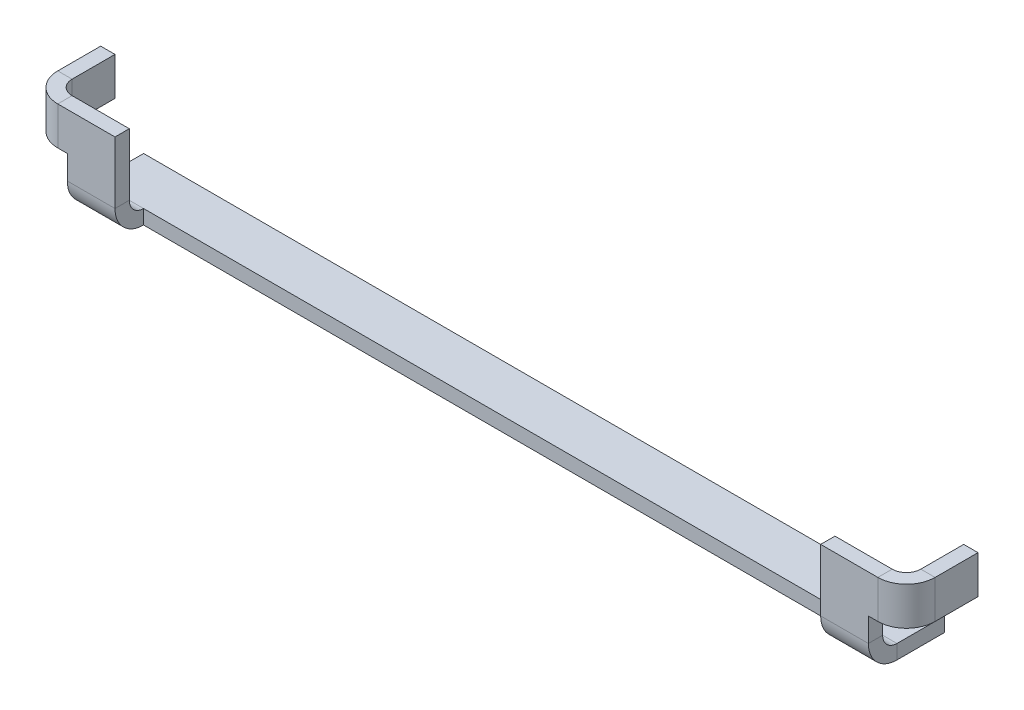
ISO-10303-21;
HEADER;
FILE_DESCRIPTION(('STEP AP214'),'2;1');
FILE_NAME('part.step','',(''),(''),'','','');
FILE_SCHEMA(('AUTOMOTIVE_DESIGN { 1 0 10303 214 1 1 1 1 }'));
ENDSEC;
DATA;
#1=APPLICATION_CONTEXT('core data for automotive mechanical design processes');
#2=APPLICATION_PROTOCOL_DEFINITION('international standard','automotive_design',2000,#1);
#3=PRODUCT_CONTEXT('',#1,'mechanical');
#4=PRODUCT('Part','Part','',(#3));
#5=PRODUCT_RELATED_PRODUCT_CATEGORY('part','',(#4));
#6=PRODUCT_DEFINITION_FORMATION('','',#4);
#7=PRODUCT_DEFINITION_CONTEXT('part definition',#1,'design');
#8=PRODUCT_DEFINITION('design','',#6,#7);
#9=PRODUCT_DEFINITION_SHAPE('','',#8);
#10=(LENGTH_UNIT() NAMED_UNIT(*) SI_UNIT(.MILLI.,.METRE.));
#11=(NAMED_UNIT(*) PLANE_ANGLE_UNIT() SI_UNIT($,.RADIAN.));
#12=(NAMED_UNIT(*) SI_UNIT($,.STERADIAN.) SOLID_ANGLE_UNIT());
#13=UNCERTAINTY_MEASURE_WITH_UNIT(LENGTH_MEASURE(1.E-05),#10,'distance_accuracy_value','');
#14=(GEOMETRIC_REPRESENTATION_CONTEXT(3) GLOBAL_UNCERTAINTY_ASSIGNED_CONTEXT((#13)) GLOBAL_UNIT_ASSIGNED_CONTEXT((#10,
#11,#12)) REPRESENTATION_CONTEXT('',''));
#15=CARTESIAN_POINT('',(0.,0.,0.));
#16=DIRECTION('',(0.,0.,1.));
#17=DIRECTION('',(1.,0.,0.));
#18=AXIS2_PLACEMENT_3D('',#15,#16,#17);
#19=CARTESIAN_POINT('',(0.,1.5,0.));
#20=DIRECTION('',(0.,-1.,0.));
#21=DIRECTION('',(0.,0.,-1.));
#22=AXIS2_PLACEMENT_3D('',#19,#20,#21);
#23=PLANE('',#22);
#24=DIRECTION('',(0.,0.,-1.));
#25=VECTOR('',#24,1.);
#26=CARTESIAN_POINT('',(-42.,1.5,0.));
#27=LINE('',#26,#25);
#28=CARTESIAN_POINT('',(-42.,1.5,37.5));
#29=VERTEX_POINT('',#28);
#30=CARTESIAN_POINT('',(-42.,1.5,42.5));
#31=VERTEX_POINT('',#30);
#32=EDGE_CURVE('E502',#29,#31,#27,.F.);
#33=ORIENTED_EDGE('',*,*,#32,.T.);
#34=DIRECTION('',(-1.,0.,0.));
#35=VECTOR('',#34,1.);
#36=CARTESIAN_POINT('',(-37.,1.5,42.5));
#37=LINE('',#36,#35);
#38=CARTESIAN_POINT('',(-37.,1.5,42.5));
#39=VERTEX_POINT('',#38);
#40=EDGE_CURVE('E358',#31,#39,#37,.F.);
#41=ORIENTED_EDGE('',*,*,#40,.T.);
#42=DIRECTION('',(1.,0.,0.));
#43=VECTOR('',#42,1.);
#44=CARTESIAN_POINT('',(-37.,1.5,42.5));
#45=LINE('',#44,#43);
#46=CARTESIAN_POINT('',(37.,1.5,42.5));
#47=VERTEX_POINT('',#46);
#48=EDGE_CURVE('E489',#39,#47,#45,.T.);
#49=ORIENTED_EDGE('',*,*,#48,.T.);
#50=DIRECTION('',(-1.,0.,0.));
#51=VECTOR('',#50,1.);
#52=CARTESIAN_POINT('',(42.,1.5,42.5));
#53=LINE('',#52,#51);
#54=CARTESIAN_POINT('',(42.,1.5,42.5));
#55=VERTEX_POINT('',#54);
#56=EDGE_CURVE('E453',#47,#55,#53,.F.);
#57=ORIENTED_EDGE('',*,*,#56,.T.);
#58=DIRECTION('',(0.,0.,-1.));
#59=VECTOR('',#58,1.);
#60=CARTESIAN_POINT('',(42.,1.5,0.));
#61=LINE('',#60,#59);
#62=CARTESIAN_POINT('',(42.,1.5,37.5));
#63=VERTEX_POINT('',#62);
#64=EDGE_CURVE('E503',#55,#63,#61,.T.);
#65=ORIENTED_EDGE('',*,*,#64,.T.);
#66=DIRECTION('',(1.,0.,0.));
#67=VECTOR('',#66,1.);
#68=CARTESIAN_POINT('',(0.,1.5,37.5));
#69=LINE('',#68,#67);
#70=EDGE_CURVE('E500',#63,#29,#69,.F.);
#71=ORIENTED_EDGE('',*,*,#70,.T.);
#72=EDGE_LOOP('',(#33,#41,#49,#57,#65,#71));
#73=FACE_BOUND('',#72,.T.);
#74=ADVANCED_FACE('F47',(#73),#23,.F.);
#75=CARTESIAN_POINT('',(0.,0.,0.));
#76=DIRECTION('',(0.,-1.,0.));
#77=DIRECTION('',(0.,0.,-1.));
#78=AXIS2_PLACEMENT_3D('',#75,#76,#77);
#79=PLANE('',#78);
#80=DIRECTION('',(1.,0.,0.));
#81=VECTOR('',#80,1.);
#82=CARTESIAN_POINT('',(0.,0.,42.5));
#83=LINE('',#82,#81);
#84=CARTESIAN_POINT('',(-42.,0.,42.5));
#85=VERTEX_POINT('',#84);
#86=CARTESIAN_POINT('',(-37.,0.,42.5));
#87=VERTEX_POINT('',#86);
#88=EDGE_CURVE('E363',#85,#87,#83,.T.);
#89=ORIENTED_EDGE('',*,*,#88,.F.);
#90=DIRECTION('',(0.,0.,1.));
#91=VECTOR('',#90,1.);
#92=CARTESIAN_POINT('',(-42.,0.,0.));
#93=LINE('',#92,#91);
#94=CARTESIAN_POINT('',(-42.,0.,37.5));
#95=VERTEX_POINT('',#94);
#96=EDGE_CURVE('E497',#95,#85,#93,.T.);
#97=ORIENTED_EDGE('',*,*,#96,.F.);
#98=DIRECTION('',(-1.,0.,0.));
#99=VECTOR('',#98,1.);
#100=CARTESIAN_POINT('',(0.,0.,37.5));
#101=LINE('',#100,#99);
#102=CARTESIAN_POINT('',(42.,0.,37.5));
#103=VERTEX_POINT('',#102);
#104=EDGE_CURVE('E494',#103,#95,#101,.T.);
#105=ORIENTED_EDGE('',*,*,#104,.F.);
#106=DIRECTION('',(0.,0.,-1.));
#107=VECTOR('',#106,1.);
#108=CARTESIAN_POINT('',(42.,0.,0.));
#109=LINE('',#108,#107);
#110=CARTESIAN_POINT('',(42.,0.,42.5));
#111=VERTEX_POINT('',#110);
#112=EDGE_CURVE('E498',#111,#103,#109,.T.);
#113=ORIENTED_EDGE('',*,*,#112,.F.);
#114=DIRECTION('',(1.,0.,0.));
#115=VECTOR('',#114,1.);
#116=CARTESIAN_POINT('',(0.,0.,42.5));
#117=LINE('',#116,#115);
#118=CARTESIAN_POINT('',(37.,0.,42.5));
#119=VERTEX_POINT('',#118);
#120=EDGE_CURVE('E372',#119,#111,#117,.T.);
#121=ORIENTED_EDGE('',*,*,#120,.F.);
#122=DIRECTION('',(1.,0.,0.));
#123=VECTOR('',#122,1.);
#124=CARTESIAN_POINT('',(0.,0.,42.5));
#125=LINE('',#124,#123);
#126=EDGE_CURVE('E409',#87,#119,#125,.T.);
#127=ORIENTED_EDGE('',*,*,#126,.F.);
#128=EDGE_LOOP('',(#89,#97,#105,#113,#121,#127));
#129=FACE_BOUND('',#128,.T.);
#130=ADVANCED_FACE('F640',(#129),#79,.T.);
#131=CARTESIAN_POINT('',(44.5,5.5,44.));
#132=DIRECTION('',(0.,1.,0.));
#133=DIRECTION('',(-1.,0.,0.));
#134=AXIS2_PLACEMENT_3D('',#131,#132,#133);
#135=PLANE('',#134);
#136=DIRECTION('',(0.,0.,-1.));
#137=VECTOR('',#136,1.);
#138=CARTESIAN_POINT('',(43.,5.5,44.));
#139=LINE('',#138,#137);
#140=CARTESIAN_POINT('',(43.,5.5,45.5));
#141=VERTEX_POINT('',#140);
#142=CARTESIAN_POINT('',(43.,5.5,44.));
#143=VERTEX_POINT('',#142);
#144=EDGE_CURVE('E11',#141,#143,#139,.T.);
#145=ORIENTED_EDGE('',*,*,#144,.F.);
#146=DIRECTION('',(1.,0.,0.));
#147=VECTOR('',#146,1.);
#148=CARTESIAN_POINT('',(37.,5.5,45.5));
#149=LINE('',#148,#147);
#150=CARTESIAN_POINT('',(42.,5.5,45.5));
#151=VERTEX_POINT('',#150);
#152=EDGE_CURVE('E157',#141,#151,#149,.F.);
#153=ORIENTED_EDGE('',*,*,#152,.T.);
#154=DIRECTION('',(0.,0.,-1.));
#155=VECTOR('',#154,1.);
#156=CARTESIAN_POINT('',(42.,5.5,44.));
#157=LINE('',#156,#155);
#158=CARTESIAN_POINT('',(42.,5.5,44.));
#159=VERTEX_POINT('',#158);
#160=EDGE_CURVE('E58',#151,#159,#157,.T.);
#161=ORIENTED_EDGE('',*,*,#160,.T.);
#162=DIRECTION('',(-1.,0.,0.));
#163=VECTOR('',#162,1.);
#164=CARTESIAN_POINT('',(44.5,5.5,44.));
#165=LINE('',#164,#163);
#166=EDGE_CURVE('E160',#143,#159,#165,.T.);
#167=ORIENTED_EDGE('',*,*,#166,.F.);
#168=EDGE_LOOP('',(#145,#153,#161,#167));
#169=FACE_BOUND('',#168,.T.);
#170=ADVANCED_FACE('F154',(#169),#135,.F.);
#171=CARTESIAN_POINT('',(42.,9.5,44.));
#172=DIRECTION('',(-1.,0.,0.));
#173=DIRECTION('',(0.,-1.,0.));
#174=AXIS2_PLACEMENT_3D('',#171,#172,#173);
#175=PLANE('',#174);
#176=ORIENTED_EDGE('',*,*,#160,.F.);
#177=DIRECTION('',(0.,1.,0.));
#178=VECTOR('',#177,1.);
#179=CARTESIAN_POINT('',(42.,9.5,45.5));
#180=LINE('',#179,#178);
#181=CARTESIAN_POINT('',(42.,3.,45.5));
#182=VERTEX_POINT('',#181);
#183=EDGE_CURVE('E188',#151,#182,#180,.F.);
#184=ORIENTED_EDGE('',*,*,#183,.T.);
#185=DIRECTION('',(0.,0.,-1.));
#186=VECTOR('',#185,1.);
#187=CARTESIAN_POINT('',(42.,3.,44.));
#188=LINE('',#187,#186);
#189=CARTESIAN_POINT('',(42.,3.,44.));
#190=VERTEX_POINT('',#189);
#191=EDGE_CURVE('E272',#182,#190,#188,.T.);
#192=ORIENTED_EDGE('',*,*,#191,.T.);
#193=DIRECTION('',(0.,-1.,0.));
#194=VECTOR('',#193,1.);
#195=CARTESIAN_POINT('',(42.,9.5,44.));
#196=LINE('',#195,#194);
#197=EDGE_CURVE('E291',#159,#190,#196,.T.);
#198=ORIENTED_EDGE('',*,*,#197,.F.);
#199=EDGE_LOOP('',(#176,#184,#192,#198));
#200=FACE_BOUND('',#199,.T.);
#201=ADVANCED_FACE('F299',(#200),#175,.F.);
#202=CARTESIAN_POINT('',(42.,3.,42.5));
#203=DIRECTION('',(1.,0.,0.));
#204=DIRECTION('',(0.,0.,-1.));
#205=AXIS2_PLACEMENT_3D('',#202,#203,#204);
#206=PLANE('',#205);
#207=ORIENTED_EDGE('',*,*,#191,.F.);
#208=CARTESIAN_POINT('',(42.,3.,42.5));
#209=DIRECTION('',(1.,0.,0.));
#210=DIRECTION('',(0.,0.,-1.));
#211=AXIS2_PLACEMENT_3D('',#208,#209,#210);
#212=CIRCLE('',#211,3.);
#213=EDGE_CURVE('E203',#182,#111,#212,.T.);
#214=ORIENTED_EDGE('',*,*,#213,.T.);
#215=DIRECTION('',(0.,1.,0.));
#216=VECTOR('',#215,1.);
#217=CARTESIAN_POINT('',(42.,1.5,42.5));
#218=LINE('',#217,#216);
#219=EDGE_CURVE('E268',#111,#55,#218,.T.);
#220=ORIENTED_EDGE('',*,*,#219,.T.);
#221=CARTESIAN_POINT('',(42.,3.,42.5));
#222=DIRECTION('',(-1.,0.,0.));
#223=DIRECTION('',(0.,0.,1.));
#224=AXIS2_PLACEMENT_3D('',#221,#222,#223);
#225=CIRCLE('',#224,1.5);
#226=EDGE_CURVE('E448',#190,#55,#225,.F.);
#227=ORIENTED_EDGE('',*,*,#226,.F.);
#228=EDGE_LOOP('',(#207,#214,#220,#227));
#229=FACE_BOUND('',#228,.T.);
#230=ADVANCED_FACE('F1082',(#229),#206,.T.);
#231=CARTESIAN_POINT('',(-42.,3.,42.5));
#232=DIRECTION('',(1.,0.,0.));
#233=DIRECTION('',(0.,0.,-1.));
#234=AXIS2_PLACEMENT_3D('',#231,#232,#233);
#235=PLANE('',#234);
#236=DIRECTION('',(0.,1.,0.));
#237=VECTOR('',#236,1.);
#238=CARTESIAN_POINT('',(-42.,1.5,42.5));
#239=LINE('',#238,#237);
#240=EDGE_CURVE('E265',#85,#31,#239,.T.);
#241=ORIENTED_EDGE('',*,*,#240,.F.);
#242=CARTESIAN_POINT('',(-42.,3.,42.5));
#243=DIRECTION('',(1.,0.,0.));
#244=DIRECTION('',(0.,0.,-1.));
#245=AXIS2_PLACEMENT_3D('',#242,#243,#244);
#246=CIRCLE('',#245,3.);
#247=CARTESIAN_POINT('',(-42.,3.,45.5));
#248=VERTEX_POINT('',#247);
#249=EDGE_CURVE('E419',#85,#248,#246,.F.);
#250=ORIENTED_EDGE('',*,*,#249,.T.);
#251=DIRECTION('',(0.,0.,-1.));
#252=VECTOR('',#251,1.);
#253=CARTESIAN_POINT('',(-42.,3.,44.));
#254=LINE('',#253,#252);
#255=CARTESIAN_POINT('',(-42.,3.,44.));
#256=VERTEX_POINT('',#255);
#257=EDGE_CURVE('E66',#248,#256,#254,.T.);
#258=ORIENTED_EDGE('',*,*,#257,.T.);
#259=CARTESIAN_POINT('',(-42.,3.,42.5));
#260=DIRECTION('',(-1.,0.,0.));
#261=DIRECTION('',(0.,0.,1.));
#262=AXIS2_PLACEMENT_3D('',#259,#260,#261);
#263=CIRCLE('',#262,1.5);
#264=EDGE_CURVE('E361',#31,#256,#263,.T.);
#265=ORIENTED_EDGE('',*,*,#264,.F.);
#266=EDGE_LOOP('',(#241,#250,#258,#265));
#267=FACE_BOUND('',#266,.T.);
#268=ADVANCED_FACE('F1069',(#267),#235,.F.);
#269=CARTESIAN_POINT('',(-42.,9.5,44.));
#270=DIRECTION('',(-1.,0.,0.));
#271=DIRECTION('',(0.,-1.,0.));
#272=AXIS2_PLACEMENT_3D('',#269,#270,#271);
#273=PLANE('',#272);
#274=ORIENTED_EDGE('',*,*,#257,.F.);
#275=DIRECTION('',(0.,1.,0.));
#276=VECTOR('',#275,1.);
#277=CARTESIAN_POINT('',(-42.,9.5,45.5));
#278=LINE('',#277,#276);
#279=CARTESIAN_POINT('',(-42.,5.5,45.5));
#280=VERTEX_POINT('',#279);
#281=EDGE_CURVE('E196',#280,#248,#278,.F.);
#282=ORIENTED_EDGE('',*,*,#281,.F.);
#283=DIRECTION('',(0.,0.,-1.));
#284=VECTOR('',#283,1.);
#285=CARTESIAN_POINT('',(-42.,5.5,44.));
#286=LINE('',#285,#284);
#287=CARTESIAN_POINT('',(-42.,5.5,44.));
#288=VERTEX_POINT('',#287);
#289=EDGE_CURVE('E261',#280,#288,#286,.T.);
#290=ORIENTED_EDGE('',*,*,#289,.T.);
#291=DIRECTION('',(0.,-1.,0.));
#292=VECTOR('',#291,1.);
#293=CARTESIAN_POINT('',(-42.,9.5,44.));
#294=LINE('',#293,#292);
#295=EDGE_CURVE('E444',#288,#256,#294,.T.);
#296=ORIENTED_EDGE('',*,*,#295,.T.);
#297=EDGE_LOOP('',(#274,#282,#290,#296));
#298=FACE_BOUND('',#297,.T.);
#299=ADVANCED_FACE('F563',(#298),#273,.T.);
#300=CARTESIAN_POINT('',(-44.5,5.5,44.));
#301=DIRECTION('',(0.,1.,0.));
#302=DIRECTION('',(-1.,0.,0.));
#303=AXIS2_PLACEMENT_3D('',#300,#301,#302);
#304=PLANE('',#303);
#305=ORIENTED_EDGE('',*,*,#289,.F.);
#306=DIRECTION('',(1.,0.,0.));
#307=VECTOR('',#306,1.);
#308=CARTESIAN_POINT('',(-42.,5.5,45.5));
#309=LINE('',#308,#307);
#310=CARTESIAN_POINT('',(-43.,5.5,45.5));
#311=VERTEX_POINT('',#310);
#312=EDGE_CURVE('E200',#280,#311,#309,.F.);
#313=ORIENTED_EDGE('',*,*,#312,.T.);
#314=DIRECTION('',(0.,0.,-1.));
#315=VECTOR('',#314,1.);
#316=CARTESIAN_POINT('',(-43.,5.5,44.));
#317=LINE('',#316,#315);
#318=CARTESIAN_POINT('',(-43.,5.5,44.));
#319=VERTEX_POINT('',#318);
#320=EDGE_CURVE('E258',#311,#319,#317,.T.);
#321=ORIENTED_EDGE('',*,*,#320,.T.);
#322=DIRECTION('',(-1.,0.,0.));
#323=VECTOR('',#322,1.);
#324=CARTESIAN_POINT('',(-44.5,5.5,44.));
#325=LINE('',#324,#323);
#326=EDGE_CURVE('E527',#288,#319,#325,.T.);
#327=ORIENTED_EDGE('',*,*,#326,.F.);
#328=EDGE_LOOP('',(#305,#313,#321,#327));
#329=FACE_BOUND('',#328,.T.);
#330=ADVANCED_FACE('F570',(#329),#304,.F.);
#331=CARTESIAN_POINT('',(-43.,5.5,42.5));
#332=DIRECTION('',(0.,-1.,0.));
#333=DIRECTION('',(0.,0.,-1.));
#334=AXIS2_PLACEMENT_3D('',#331,#332,#333);
#335=PLANE('',#334);
#336=ORIENTED_EDGE('',*,*,#320,.F.);
#337=CARTESIAN_POINT('',(-43.,5.5,42.5));
#338=DIRECTION('',(0.,1.,0.));
#339=DIRECTION('',(0.,0.,1.));
#340=AXIS2_PLACEMENT_3D('',#337,#338,#339);
#341=CIRCLE('',#340,3.);
#342=CARTESIAN_POINT('',(-46.,5.5,42.5));
#343=VERTEX_POINT('',#342);
#344=EDGE_CURVE('E408',#311,#343,#341,.F.);
#345=ORIENTED_EDGE('',*,*,#344,.T.);
#346=DIRECTION('',(1.,0.,0.));
#347=VECTOR('',#346,1.);
#348=CARTESIAN_POINT('',(-44.5,5.5,42.5));
#349=LINE('',#348,#347);
#350=CARTESIAN_POINT('',(-44.5,5.5,42.5));
#351=VERTEX_POINT('',#350);
#352=EDGE_CURVE('E255',#343,#351,#349,.T.);
#353=ORIENTED_EDGE('',*,*,#352,.T.);
#354=CARTESIAN_POINT('',(-43.,5.5,42.5));
#355=DIRECTION('',(0.,1.,0.));
#356=DIRECTION('',(0.,0.,1.));
#357=AXIS2_PLACEMENT_3D('',#354,#355,#356);
#358=CIRCLE('',#357,1.5);
#359=EDGE_CURVE('E351',#319,#351,#358,.F.);
#360=ORIENTED_EDGE('',*,*,#359,.F.);
#361=EDGE_LOOP('',(#336,#345,#353,#360));
#362=FACE_BOUND('',#361,.T.);
#363=ADVANCED_FACE('F577',(#362),#335,.T.);
#364=CARTESIAN_POINT('',(-44.5,5.5,49.7720018726588));
#365=DIRECTION('',(0.,-1.,0.));
#366=DIRECTION('',(0.,0.,-1.));
#367=AXIS2_PLACEMENT_3D('',#364,#365,#366);
#368=PLANE('',#367);
#369=ORIENTED_EDGE('',*,*,#352,.F.);
#370=DIRECTION('',(0.,0.,-1.));
#371=VECTOR('',#370,1.);
#372=CARTESIAN_POINT('',(-46.,5.5,49.7720018726588));
#373=LINE('',#372,#371);
#374=CARTESIAN_POINT('',(-46.,5.5,38.));
#375=VERTEX_POINT('',#374);
#376=EDGE_CURVE('E413',#343,#375,#373,.T.);
#377=ORIENTED_EDGE('',*,*,#376,.T.);
#378=DIRECTION('',(1.,0.,0.));
#379=VECTOR('',#378,1.);
#380=CARTESIAN_POINT('',(-44.5,5.5,38.));
#381=LINE('',#380,#379);
#382=CARTESIAN_POINT('',(-44.5,5.5,38.));
#383=VERTEX_POINT('',#382);
#384=EDGE_CURVE('E252',#375,#383,#381,.T.);
#385=ORIENTED_EDGE('',*,*,#384,.T.);
#386=DIRECTION('',(0.,0.,-1.));
#387=VECTOR('',#386,1.);
#388=CARTESIAN_POINT('',(-44.5,5.5,49.7720018726588));
#389=LINE('',#388,#387);
#390=EDGE_CURVE('E341',#351,#383,#389,.T.);
#391=ORIENTED_EDGE('',*,*,#390,.F.);
#392=EDGE_LOOP('',(#369,#377,#385,#391));
#393=FACE_BOUND('',#392,.T.);
#394=ADVANCED_FACE('F594',(#393),#368,.T.);
#395=CARTESIAN_POINT('',(-44.5,9.5,38.));
#396=DIRECTION('',(0.,0.,1.));
#397=DIRECTION('',(0.,-1.,0.));
#398=AXIS2_PLACEMENT_3D('',#395,#396,#397);
#399=PLANE('',#398);
#400=ORIENTED_EDGE('',*,*,#384,.F.);
#401=DIRECTION('',(0.,1.,0.));
#402=VECTOR('',#401,1.);
#403=CARTESIAN_POINT('',(-46.,9.5,38.));
#404=LINE('',#403,#402);
#405=CARTESIAN_POINT('',(-46.,9.5,38.));
#406=VERTEX_POINT('',#405);
#407=EDGE_CURVE('E429',#406,#375,#404,.F.);
#408=ORIENTED_EDGE('',*,*,#407,.F.);
#409=DIRECTION('',(1.,0.,0.));
#410=VECTOR('',#409,1.);
#411=CARTESIAN_POINT('',(-44.5,9.5,38.));
#412=LINE('',#411,#410);
#413=CARTESIAN_POINT('',(-44.5,9.5,38.));
#414=VERTEX_POINT('',#413);
#415=EDGE_CURVE('E249',#406,#414,#412,.T.);
#416=ORIENTED_EDGE('',*,*,#415,.T.);
#417=DIRECTION('',(0.,-1.,0.));
#418=VECTOR('',#417,1.);
#419=CARTESIAN_POINT('',(-44.5,9.5,38.));
#420=LINE('',#419,#418);
#421=EDGE_CURVE('E335',#414,#383,#420,.T.);
#422=ORIENTED_EDGE('',*,*,#421,.T.);
#423=EDGE_LOOP('',(#400,#408,#416,#422));
#424=FACE_BOUND('',#423,.T.);
#425=ADVANCED_FACE('F1014',(#424),#399,.F.);
#426=CARTESIAN_POINT('',(-44.5,9.5,49.7720018726588));
#427=DIRECTION('',(0.,-1.,0.));
#428=DIRECTION('',(0.,0.,-1.));
#429=AXIS2_PLACEMENT_3D('',#426,#427,#428);
#430=PLANE('',#429);
#431=ORIENTED_EDGE('',*,*,#415,.F.);
#432=DIRECTION('',(0.,0.,-1.));
#433=VECTOR('',#432,1.);
#434=CARTESIAN_POINT('',(-46.,9.5,49.7720018726588));
#435=LINE('',#434,#433);
#436=CARTESIAN_POINT('',(-46.,9.5,42.5));
#437=VERTEX_POINT('',#436);
#438=EDGE_CURVE('E403',#437,#406,#435,.T.);
#439=ORIENTED_EDGE('',*,*,#438,.F.);
#440=DIRECTION('',(1.,0.,0.));
#441=VECTOR('',#440,1.);
#442=CARTESIAN_POINT('',(-44.5,9.5,42.5));
#443=LINE('',#442,#441);
#444=CARTESIAN_POINT('',(-44.5,9.5,42.5));
#445=VERTEX_POINT('',#444);
#446=EDGE_CURVE('E246',#437,#445,#443,.T.);
#447=ORIENTED_EDGE('',*,*,#446,.T.);
#448=DIRECTION('',(0.,0.,-1.));
#449=VECTOR('',#448,1.);
#450=CARTESIAN_POINT('',(-44.5,9.5,49.7720018726588));
#451=LINE('',#450,#449);
#452=EDGE_CURVE('E332',#445,#414,#451,.T.);
#453=ORIENTED_EDGE('',*,*,#452,.T.);
#454=EDGE_LOOP('',(#431,#439,#447,#453));
#455=FACE_BOUND('',#454,.T.);
#456=ADVANCED_FACE('F1003',(#455),#430,.F.);
#457=CARTESIAN_POINT('',(-43.,9.5,42.5));
#458=DIRECTION('',(0.,1.,0.));
#459=DIRECTION('',(0.,0.,1.));
#460=AXIS2_PLACEMENT_3D('',#457,#458,#459);
#461=PLANE('',#460);
#462=ORIENTED_EDGE('',*,*,#446,.F.);
#463=CARTESIAN_POINT('',(-43.,9.5,42.5));
#464=DIRECTION('',(0.,1.,0.));
#465=DIRECTION('',(0.,0.,1.));
#466=AXIS2_PLACEMENT_3D('',#463,#464,#465);
#467=CIRCLE('',#466,3.);
#468=CARTESIAN_POINT('',(-43.,9.5,45.5));
#469=VERTEX_POINT('',#468);
#470=EDGE_CURVE('E418',#437,#469,#467,.T.);
#471=ORIENTED_EDGE('',*,*,#470,.T.);
#472=DIRECTION('',(0.,0.,-1.));
#473=VECTOR('',#472,1.);
#474=CARTESIAN_POINT('',(-43.,9.5,44.));
#475=LINE('',#474,#473);
#476=CARTESIAN_POINT('',(-43.,9.5,44.));
#477=VERTEX_POINT('',#476);
#478=EDGE_CURVE('E243',#469,#477,#475,.T.);
#479=ORIENTED_EDGE('',*,*,#478,.T.);
#480=CARTESIAN_POINT('',(-43.,9.5,42.5));
#481=DIRECTION('',(0.,-1.,0.));
#482=DIRECTION('',(0.,0.,-1.));
#483=AXIS2_PLACEMENT_3D('',#480,#481,#482);
#484=CIRCLE('',#483,1.5);
#485=EDGE_CURVE('E348',#445,#477,#484,.F.);
#486=ORIENTED_EDGE('',*,*,#485,.F.);
#487=EDGE_LOOP('',(#462,#471,#479,#486));
#488=FACE_BOUND('',#487,.T.);
#489=ADVANCED_FACE('F989',(#488),#461,.T.);
#490=CARTESIAN_POINT('',(-42.,9.5,44.));
#491=DIRECTION('',(0.,1.,0.));
#492=DIRECTION('',(-1.,0.,0.));
#493=AXIS2_PLACEMENT_3D('',#490,#491,#492);
#494=PLANE('',#493);
#495=ORIENTED_EDGE('',*,*,#478,.F.);
#496=DIRECTION('',(1.,0.,0.));
#497=VECTOR('',#496,1.);
#498=CARTESIAN_POINT('',(-42.,9.5,45.5));
#499=LINE('',#498,#497);
#500=CARTESIAN_POINT('',(-37.,9.5,45.5));
#501=VERTEX_POINT('',#500);
#502=EDGE_CURVE('E422',#501,#469,#499,.F.);
#503=ORIENTED_EDGE('',*,*,#502,.F.);
#504=DIRECTION('',(0.,0.,-1.));
#505=VECTOR('',#504,1.);
#506=CARTESIAN_POINT('',(-37.,9.5,44.));
#507=LINE('',#506,#505);
#508=CARTESIAN_POINT('',(-37.,9.5,44.));
#509=VERTEX_POINT('',#508);
#510=EDGE_CURVE('E240',#501,#509,#507,.T.);
#511=ORIENTED_EDGE('',*,*,#510,.T.);
#512=DIRECTION('',(-1.,0.,0.));
#513=VECTOR('',#512,1.);
#514=CARTESIAN_POINT('',(-42.,9.5,44.));
#515=LINE('',#514,#513);
#516=EDGE_CURVE('E532',#509,#477,#515,.T.);
#517=ORIENTED_EDGE('',*,*,#516,.T.);
#518=EDGE_LOOP('',(#495,#503,#511,#517));
#519=FACE_BOUND('',#518,.T.);
#520=ADVANCED_FACE('F978',(#519),#494,.T.);
#521=CARTESIAN_POINT('',(-37.,9.5,44.));
#522=DIRECTION('',(-1.,0.,0.));
#523=DIRECTION('',(0.,-1.,0.));
#524=AXIS2_PLACEMENT_3D('',#521,#522,#523);
#525=PLANE('',#524);
#526=ORIENTED_EDGE('',*,*,#510,.F.);
#527=DIRECTION('',(0.,1.,0.));
#528=VECTOR('',#527,1.);
#529=CARTESIAN_POINT('',(-37.,9.5,45.5));
#530=LINE('',#529,#528);
#531=CARTESIAN_POINT('',(-37.,3.,45.5));
#532=VERTEX_POINT('',#531);
#533=EDGE_CURVE('E414',#501,#532,#530,.F.);
#534=ORIENTED_EDGE('',*,*,#533,.T.);
#535=DIRECTION('',(0.,0.,-1.));
#536=VECTOR('',#535,1.);
#537=CARTESIAN_POINT('',(-37.,3.,44.));
#538=LINE('',#537,#536);
#539=CARTESIAN_POINT('',(-37.,3.,44.));
#540=VERTEX_POINT('',#539);
#541=EDGE_CURVE('E238',#532,#540,#538,.T.);
#542=ORIENTED_EDGE('',*,*,#541,.T.);
#543=DIRECTION('',(0.,-1.,0.));
#544=VECTOR('',#543,1.);
#545=CARTESIAN_POINT('',(-37.,9.5,44.));
#546=LINE('',#545,#544);
#547=EDGE_CURVE('E491',#509,#540,#546,.T.);
#548=ORIENTED_EDGE('',*,*,#547,.F.);
#549=EDGE_LOOP('',(#526,#534,#542,#548));
#550=FACE_BOUND('',#549,.T.);
#551=ADVANCED_FACE('F968',(#550),#525,.F.);
#552=CARTESIAN_POINT('',(-37.,3.,42.5));
#553=DIRECTION('',(1.,0.,0.));
#554=DIRECTION('',(0.,0.,-1.));
#555=AXIS2_PLACEMENT_3D('',#552,#553,#554);
#556=PLANE('',#555);
#557=ORIENTED_EDGE('',*,*,#541,.F.);
#558=CARTESIAN_POINT('',(-37.,3.,42.5));
#559=DIRECTION('',(1.,0.,0.));
#560=DIRECTION('',(0.,0.,-1.));
#561=AXIS2_PLACEMENT_3D('',#558,#559,#560);
#562=CIRCLE('',#561,3.);
#563=EDGE_CURVE('E415',#532,#87,#562,.T.);
#564=ORIENTED_EDGE('',*,*,#563,.T.);
#565=DIRECTION('',(0.,1.,0.));
#566=VECTOR('',#565,1.);
#567=CARTESIAN_POINT('',(-37.,1.5,42.5));
#568=LINE('',#567,#566);
#569=EDGE_CURVE('E235',#87,#39,#568,.T.);
#570=ORIENTED_EDGE('',*,*,#569,.T.);
#571=CARTESIAN_POINT('',(-37.,3.,42.5));
#572=DIRECTION('',(-1.,0.,0.));
#573=DIRECTION('',(0.,0.,1.));
#574=AXIS2_PLACEMENT_3D('',#571,#572,#573);
#575=CIRCLE('',#574,1.5);
#576=EDGE_CURVE('E352',#540,#39,#575,.F.);
#577=ORIENTED_EDGE('',*,*,#576,.F.);
#578=EDGE_LOOP('',(#557,#564,#570,#577));
#579=FACE_BOUND('',#578,.T.);
#580=ADVANCED_FACE('F554',(#579),#556,.T.);
#581=CARTESIAN_POINT('',(-37.,1.5,42.5));
#582=DIRECTION('',(0.,0.,-1.));
#583=DIRECTION('',(1.,0.,0.));
#584=AXIS2_PLACEMENT_3D('',#581,#582,#583);
#585=PLANE('',#584);
#586=ORIENTED_EDGE('',*,*,#569,.F.);
#587=ORIENTED_EDGE('',*,*,#126,.T.);
#588=DIRECTION('',(0.,1.,0.));
#589=VECTOR('',#588,1.);
#590=CARTESIAN_POINT('',(37.,1.5,42.5));
#591=LINE('',#590,#589);
#592=EDGE_CURVE('E231',#119,#47,#591,.T.);
#593=ORIENTED_EDGE('',*,*,#592,.T.);
#594=ORIENTED_EDGE('',*,*,#48,.F.);
#595=EDGE_LOOP('',(#586,#587,#593,#594));
#596=FACE_BOUND('',#595,.T.);
#597=ADVANCED_FACE('F946',(#596),#585,.F.);
#598=CARTESIAN_POINT('',(37.,3.,42.5));
#599=DIRECTION('',(1.,0.,0.));
#600=DIRECTION('',(0.,0.,-1.));
#601=AXIS2_PLACEMENT_3D('',#598,#599,#600);
#602=PLANE('',#601);
#603=ORIENTED_EDGE('',*,*,#592,.F.);
#604=CARTESIAN_POINT('',(37.,3.,42.5));
#605=DIRECTION('',(1.,0.,0.));
#606=DIRECTION('',(0.,0.,-1.));
#607=AXIS2_PLACEMENT_3D('',#604,#605,#606);
#608=CIRCLE('',#607,3.);
#609=CARTESIAN_POINT('',(37.,3.,45.5));
#610=VERTEX_POINT('',#609);
#611=EDGE_CURVE('E404',#119,#610,#608,.F.);
#612=ORIENTED_EDGE('',*,*,#611,.T.);
#613=DIRECTION('',(0.,0.,-1.));
#614=VECTOR('',#613,1.);
#615=CARTESIAN_POINT('',(37.,3.,44.));
#616=LINE('',#615,#614);
#617=CARTESIAN_POINT('',(37.,3.,44.));
#618=VERTEX_POINT('',#617);
#619=EDGE_CURVE('E227',#610,#618,#616,.T.);
#620=ORIENTED_EDGE('',*,*,#619,.T.);
#621=CARTESIAN_POINT('',(37.,3.,42.5));
#622=DIRECTION('',(-1.,0.,0.));
#623=DIRECTION('',(0.,0.,1.));
#624=AXIS2_PLACEMENT_3D('',#621,#622,#623);
#625=CIRCLE('',#624,1.5);
#626=EDGE_CURVE('E355',#47,#618,#625,.T.);
#627=ORIENTED_EDGE('',*,*,#626,.F.);
#628=EDGE_LOOP('',(#603,#612,#620,#627));
#629=FACE_BOUND('',#628,.T.);
#630=ADVANCED_FACE('F933',(#629),#602,.F.);
#631=CARTESIAN_POINT('',(37.,9.5,44.));
#632=DIRECTION('',(-1.,0.,0.));
#633=DIRECTION('',(0.,-1.,0.));
#634=AXIS2_PLACEMENT_3D('',#631,#632,#633);
#635=PLANE('',#634);
#636=ORIENTED_EDGE('',*,*,#619,.F.);
#637=DIRECTION('',(0.,1.,0.));
#638=VECTOR('',#637,1.);
#639=CARTESIAN_POINT('',(37.,9.5,45.5));
#640=LINE('',#639,#638);
#641=CARTESIAN_POINT('',(37.,9.5,45.5));
#642=VERTEX_POINT('',#641);
#643=EDGE_CURVE('E399',#642,#610,#640,.F.);
#644=ORIENTED_EDGE('',*,*,#643,.F.);
#645=DIRECTION('',(0.,0.,-1.));
#646=VECTOR('',#645,1.);
#647=CARTESIAN_POINT('',(37.,9.5,44.));
#648=LINE('',#647,#646);
#649=CARTESIAN_POINT('',(37.,9.5,44.));
#650=VERTEX_POINT('',#649);
#651=EDGE_CURVE('E223',#642,#650,#648,.T.);
#652=ORIENTED_EDGE('',*,*,#651,.T.);
#653=DIRECTION('',(0.,-1.,0.));
#654=VECTOR('',#653,1.);
#655=CARTESIAN_POINT('',(37.,9.5,44.));
#656=LINE('',#655,#654);
#657=EDGE_CURVE('E325',#650,#618,#656,.T.);
#658=ORIENTED_EDGE('',*,*,#657,.T.);
#659=EDGE_LOOP('',(#636,#644,#652,#658));
#660=FACE_BOUND('',#659,.T.);
#661=ADVANCED_FACE('F621',(#660),#635,.T.);
#662=CARTESIAN_POINT('',(37.,9.5,44.));
#663=DIRECTION('',(0.,1.,0.));
#664=DIRECTION('',(-1.,0.,0.));
#665=AXIS2_PLACEMENT_3D('',#662,#663,#664);
#666=PLANE('',#665);
#667=ORIENTED_EDGE('',*,*,#651,.F.);
#668=DIRECTION('',(1.,0.,0.));
#669=VECTOR('',#668,1.);
#670=CARTESIAN_POINT('',(37.,9.5,45.5));
#671=LINE('',#670,#669);
#672=CARTESIAN_POINT('',(43.,9.5,45.5));
#673=VERTEX_POINT('',#672);
#674=EDGE_CURVE('E190',#673,#642,#671,.F.);
#675=ORIENTED_EDGE('',*,*,#674,.F.);
#676=DIRECTION('',(0.,0.,-1.));
#677=VECTOR('',#676,1.);
#678=CARTESIAN_POINT('',(43.,9.5,44.));
#679=LINE('',#678,#677);
#680=CARTESIAN_POINT('',(43.,9.5,44.));
#681=VERTEX_POINT('',#680);
#682=EDGE_CURVE('E219',#673,#681,#679,.T.);
#683=ORIENTED_EDGE('',*,*,#682,.T.);
#684=DIRECTION('',(-1.,0.,0.));
#685=VECTOR('',#684,1.);
#686=CARTESIAN_POINT('',(37.,9.5,44.));
#687=LINE('',#686,#685);
#688=EDGE_CURVE('E297',#681,#650,#687,.T.);
#689=ORIENTED_EDGE('',*,*,#688,.T.);
#690=EDGE_LOOP('',(#667,#675,#683,#689));
#691=FACE_BOUND('',#690,.T.);
#692=ADVANCED_FACE('F627',(#691),#666,.T.);
#693=CARTESIAN_POINT('',(43.,9.5,42.5));
#694=DIRECTION('',(0.,-1.,0.));
#695=DIRECTION('',(0.,0.,-1.));
#696=AXIS2_PLACEMENT_3D('',#693,#694,#695);
#697=PLANE('',#696);
#698=ORIENTED_EDGE('',*,*,#682,.F.);
#699=CARTESIAN_POINT('',(43.,9.5,42.5));
#700=DIRECTION('',(0.,1.,0.));
#701=DIRECTION('',(0.,0.,1.));
#702=AXIS2_PLACEMENT_3D('',#699,#700,#701);
#703=CIRCLE('',#702,3.);
#704=CARTESIAN_POINT('',(46.,9.5,42.5));
#705=VERTEX_POINT('',#704);
#706=EDGE_CURVE('E176',#673,#705,#703,.T.);
#707=ORIENTED_EDGE('',*,*,#706,.T.);
#708=DIRECTION('',(-1.,0.,0.));
#709=VECTOR('',#708,1.);
#710=CARTESIAN_POINT('',(44.5,9.5,42.5));
#711=LINE('',#710,#709);
#712=CARTESIAN_POINT('',(44.5,9.5,42.5));
#713=VERTEX_POINT('',#712);
#714=EDGE_CURVE('E215',#705,#713,#711,.T.);
#715=ORIENTED_EDGE('',*,*,#714,.T.);
#716=CARTESIAN_POINT('',(43.,9.5,42.5));
#717=DIRECTION('',(0.,1.,0.));
#718=DIRECTION('',(0.,0.,1.));
#719=AXIS2_PLACEMENT_3D('',#716,#717,#718);
#720=CIRCLE('',#719,1.5);
#721=EDGE_CURVE('E445',#681,#713,#720,.T.);
#722=ORIENTED_EDGE('',*,*,#721,.F.);
#723=EDGE_LOOP('',(#698,#707,#715,#722));
#724=FACE_BOUND('',#723,.T.);
#725=ADVANCED_FACE('F630',(#724),#697,.F.);
#726=CARTESIAN_POINT('',(44.5,9.5,49.7720018726588));
#727=DIRECTION('',(0.,1.,0.));
#728=DIRECTION('',(0.,0.,-1.));
#729=AXIS2_PLACEMENT_3D('',#726,#727,#728);
#730=PLANE('',#729);
#731=ORIENTED_EDGE('',*,*,#714,.F.);
#732=DIRECTION('',(0.,0.,1.));
#733=VECTOR('',#732,1.);
#734=CARTESIAN_POINT('',(46.,9.5,49.7720018726588));
#735=LINE('',#734,#733);
#736=CARTESIAN_POINT('',(46.,9.5,38.));
#737=VERTEX_POINT('',#736);
#738=EDGE_CURVE('E390',#705,#737,#735,.F.);
#739=ORIENTED_EDGE('',*,*,#738,.T.);
#740=DIRECTION('',(-1.,0.,0.));
#741=VECTOR('',#740,1.);
#742=CARTESIAN_POINT('',(44.5,9.5,38.));
#743=LINE('',#742,#741);
#744=CARTESIAN_POINT('',(44.5,9.5,38.));
#745=VERTEX_POINT('',#744);
#746=EDGE_CURVE('E211',#737,#745,#743,.T.);
#747=ORIENTED_EDGE('',*,*,#746,.T.);
#748=DIRECTION('',(0.,0.,-1.));
#749=VECTOR('',#748,1.);
#750=CARTESIAN_POINT('',(44.5,9.5,49.7720018726588));
#751=LINE('',#750,#749);
#752=EDGE_CURVE('E304',#713,#745,#751,.T.);
#753=ORIENTED_EDGE('',*,*,#752,.F.);
#754=EDGE_LOOP('',(#731,#739,#747,#753));
#755=FACE_BOUND('',#754,.T.);
#756=ADVANCED_FACE('F481',(#755),#730,.T.);
#757=CARTESIAN_POINT('',(44.5,9.5,38.));
#758=DIRECTION('',(0.,0.,1.));
#759=DIRECTION('',(0.,1.,0.));
#760=AXIS2_PLACEMENT_3D('',#757,#758,#759);
#761=PLANE('',#760);
#762=ORIENTED_EDGE('',*,*,#746,.F.);
#763=DIRECTION('',(0.,1.,0.));
#764=VECTOR('',#763,1.);
#765=CARTESIAN_POINT('',(46.,9.5,38.));
#766=LINE('',#765,#764);
#767=CARTESIAN_POINT('',(46.,5.5,38.));
#768=VERTEX_POINT('',#767);
#769=EDGE_CURVE('E367',#768,#737,#766,.T.);
#770=ORIENTED_EDGE('',*,*,#769,.F.);
#771=DIRECTION('',(-1.,0.,0.));
#772=VECTOR('',#771,1.);
#773=CARTESIAN_POINT('',(44.5,5.5,38.));
#774=LINE('',#773,#772);
#775=CARTESIAN_POINT('',(44.5,5.5,38.));
#776=VERTEX_POINT('',#775);
#777=EDGE_CURVE('E207',#768,#776,#774,.T.);
#778=ORIENTED_EDGE('',*,*,#777,.T.);
#779=DIRECTION('',(0.,1.,0.));
#780=VECTOR('',#779,1.);
#781=CARTESIAN_POINT('',(44.5,9.5,38.));
#782=LINE('',#781,#780);
#783=EDGE_CURVE('E315',#776,#745,#782,.T.);
#784=ORIENTED_EDGE('',*,*,#783,.T.);
#785=EDGE_LOOP('',(#762,#770,#778,#784));
#786=FACE_BOUND('',#785,.T.);
#787=ADVANCED_FACE('F484',(#786),#761,.F.);
#788=CARTESIAN_POINT('',(44.5,5.5,49.7720018726588));
#789=DIRECTION('',(0.,1.,0.));
#790=DIRECTION('',(0.,0.,-1.));
#791=AXIS2_PLACEMENT_3D('',#788,#789,#790);
#792=PLANE('',#791);
#793=ORIENTED_EDGE('',*,*,#777,.F.);
#794=DIRECTION('',(0.,0.,1.));
#795=VECTOR('',#794,1.);
#796=CARTESIAN_POINT('',(46.,5.5,49.7720018726588));
#797=LINE('',#796,#795);
#798=CARTESIAN_POINT('',(46.,5.5,42.5));
#799=VERTEX_POINT('',#798);
#800=EDGE_CURVE('E387',#799,#768,#797,.F.);
#801=ORIENTED_EDGE('',*,*,#800,.F.);
#802=DIRECTION('',(-1.,0.,0.));
#803=VECTOR('',#802,1.);
#804=CARTESIAN_POINT('',(44.5,5.5,42.5));
#805=LINE('',#804,#803);
#806=CARTESIAN_POINT('',(44.5,5.5,42.5));
#807=VERTEX_POINT('',#806);
#808=EDGE_CURVE('E51',#799,#807,#805,.T.);
#809=ORIENTED_EDGE('',*,*,#808,.T.);
#810=DIRECTION('',(0.,0.,-1.));
#811=VECTOR('',#810,1.);
#812=CARTESIAN_POINT('',(44.5,5.5,49.7720018726588));
#813=LINE('',#812,#811);
#814=EDGE_CURVE('E300',#807,#776,#813,.T.);
#815=ORIENTED_EDGE('',*,*,#814,.T.);
#816=EDGE_LOOP('',(#793,#801,#809,#815));
#817=FACE_BOUND('',#816,.T.);
#818=ADVANCED_FACE('F459',(#817),#792,.F.);
#819=CARTESIAN_POINT('',(43.,5.5,42.5));
#820=DIRECTION('',(0.,1.,0.));
#821=DIRECTION('',(0.,0.,1.));
#822=AXIS2_PLACEMENT_3D('',#819,#820,#821);
#823=PLANE('',#822);
#824=CARTESIAN_POINT('',(43.,5.5,42.5));
#825=DIRECTION('',(0.,1.,0.));
#826=DIRECTION('',(0.,0.,1.));
#827=AXIS2_PLACEMENT_3D('',#824,#825,#826);
#828=CIRCLE('',#827,3.);
#829=EDGE_CURVE('E173',#799,#141,#828,.F.);
#830=ORIENTED_EDGE('',*,*,#829,.T.);
#831=ORIENTED_EDGE('',*,*,#144,.T.);
#832=CARTESIAN_POINT('',(43.,5.5,42.5));
#833=DIRECTION('',(0.,-1.,0.));
#834=DIRECTION('',(0.,0.,-1.));
#835=AXIS2_PLACEMENT_3D('',#832,#833,#834);
#836=CIRCLE('',#835,1.5);
#837=EDGE_CURVE('E443',#807,#143,#836,.T.);
#838=ORIENTED_EDGE('',*,*,#837,.F.);
#839=ORIENTED_EDGE('',*,*,#808,.F.);
#840=EDGE_LOOP('',(#830,#831,#838,#839));
#841=FACE_BOUND('',#840,.T.);
#842=ADVANCED_FACE('F49',(#841),#823,.F.);
#843=CARTESIAN_POINT('',(44.5,9.5,49.7720018726588));
#844=DIRECTION('',(-1.,0.,0.));
#845=DIRECTION('',(0.,0.,1.));
#846=AXIS2_PLACEMENT_3D('',#843,#844,#845);
#847=PLANE('',#846);
#848=ORIENTED_EDGE('',*,*,#814,.F.);
#849=DIRECTION('',(0.,1.,0.));
#850=VECTOR('',#849,1.);
#851=CARTESIAN_POINT('',(44.5,9.5,42.5));
#852=LINE('',#851,#850);
#853=EDGE_CURVE('E319',#807,#713,#852,.T.);
#854=ORIENTED_EDGE('',*,*,#853,.T.);
#855=ORIENTED_EDGE('',*,*,#752,.T.);
#856=ORIENTED_EDGE('',*,*,#783,.F.);
#857=EDGE_LOOP('',(#848,#854,#855,#856));
#858=FACE_BOUND('',#857,.T.);
#859=ADVANCED_FACE('F466',(#858),#847,.T.);
#860=CARTESIAN_POINT('',(37.,9.5,44.));
#861=DIRECTION('',(0.,0.,1.));
#862=DIRECTION('',(1.,0.,0.));
#863=AXIS2_PLACEMENT_3D('',#860,#861,#862);
#864=PLANE('',#863);
#865=ORIENTED_EDGE('',*,*,#197,.T.);
#866=DIRECTION('',(-1.,0.,0.));
#867=VECTOR('',#866,1.);
#868=CARTESIAN_POINT('',(37.,3.,44.));
#869=LINE('',#868,#867);
#870=EDGE_CURVE('E452',#190,#618,#869,.T.);
#871=ORIENTED_EDGE('',*,*,#870,.T.);
#872=ORIENTED_EDGE('',*,*,#657,.F.);
#873=ORIENTED_EDGE('',*,*,#688,.F.);
#874=DIRECTION('',(0.,1.,0.));
#875=VECTOR('',#874,1.);
#876=CARTESIAN_POINT('',(43.,9.5,44.));
#877=LINE('',#876,#875);
#878=EDGE_CURVE('E295',#681,#143,#877,.F.);
#879=ORIENTED_EDGE('',*,*,#878,.T.);
#880=ORIENTED_EDGE('',*,*,#166,.T.);
#881=EDGE_LOOP('',(#865,#871,#872,#873,#879,#880));
#882=FACE_BOUND('',#881,.T.);
#883=ADVANCED_FACE('F288',(#882),#864,.F.);
#884=CARTESIAN_POINT('',(-44.5,9.5,49.7720018726588));
#885=DIRECTION('',(1.,0.,0.));
#886=DIRECTION('',(0.,0.,-1.));
#887=AXIS2_PLACEMENT_3D('',#884,#885,#886);
#888=PLANE('',#887);
#889=ORIENTED_EDGE('',*,*,#452,.F.);
#890=DIRECTION('',(0.,1.,0.));
#891=VECTOR('',#890,1.);
#892=CARTESIAN_POINT('',(-44.5,9.5,42.5));
#893=LINE('',#892,#891);
#894=EDGE_CURVE('E343',#445,#351,#893,.F.);
#895=ORIENTED_EDGE('',*,*,#894,.T.);
#896=ORIENTED_EDGE('',*,*,#390,.T.);
#897=ORIENTED_EDGE('',*,*,#421,.F.);
#898=EDGE_LOOP('',(#889,#895,#896,#897));
#899=FACE_BOUND('',#898,.T.);
#900=ADVANCED_FACE('F650',(#899),#888,.T.);
#901=CARTESIAN_POINT('',(-42.,9.5,44.));
#902=DIRECTION('',(0.,0.,1.));
#903=DIRECTION('',(1.,0.,0.));
#904=AXIS2_PLACEMENT_3D('',#901,#902,#903);
#905=PLANE('',#904);
#906=ORIENTED_EDGE('',*,*,#547,.T.);
#907=DIRECTION('',(-1.,0.,0.));
#908=VECTOR('',#907,1.);
#909=CARTESIAN_POINT('',(-42.,3.,44.));
#910=LINE('',#909,#908);
#911=EDGE_CURVE('E346',#540,#256,#910,.T.);
#912=ORIENTED_EDGE('',*,*,#911,.T.);
#913=ORIENTED_EDGE('',*,*,#295,.F.);
#914=ORIENTED_EDGE('',*,*,#326,.T.);
#915=DIRECTION('',(0.,1.,0.));
#916=VECTOR('',#915,1.);
#917=CARTESIAN_POINT('',(-43.,9.5,44.));
#918=LINE('',#917,#916);
#919=EDGE_CURVE('E347',#319,#477,#918,.T.);
#920=ORIENTED_EDGE('',*,*,#919,.T.);
#921=ORIENTED_EDGE('',*,*,#516,.F.);
#922=EDGE_LOOP('',(#906,#912,#913,#914,#920,#921));
#923=FACE_BOUND('',#922,.T.);
#924=ADVANCED_FACE('F547',(#923),#905,.F.);
#925=CARTESIAN_POINT('',(43.,9.5,42.5));
#926=DIRECTION('',(0.,1.,0.));
#927=DIRECTION('',(0.,0.,1.));
#928=AXIS2_PLACEMENT_3D('',#925,#926,#927);
#929=CYLINDRICAL_SURFACE('',#928,1.5);
#930=ORIENTED_EDGE('',*,*,#837,.T.);
#931=ORIENTED_EDGE('',*,*,#878,.F.);
#932=ORIENTED_EDGE('',*,*,#721,.T.);
#933=ORIENTED_EDGE('',*,*,#853,.F.);
#934=EDGE_LOOP('',(#930,#931,#932,#933));
#935=FACE_BOUND('',#934,.T.);
#936=ADVANCED_FACE('F471',(#935),#929,.F.);
#937=CARTESIAN_POINT('',(37.,3.,42.5));
#938=DIRECTION('',(1.,0.,0.));
#939=DIRECTION('',(0.,0.,-1.));
#940=AXIS2_PLACEMENT_3D('',#937,#938,#939);
#941=CYLINDRICAL_SURFACE('',#940,1.5);
#942=ORIENTED_EDGE('',*,*,#226,.T.);
#943=ORIENTED_EDGE('',*,*,#56,.F.);
#944=ORIENTED_EDGE('',*,*,#626,.T.);
#945=ORIENTED_EDGE('',*,*,#870,.F.);
#946=EDGE_LOOP('',(#942,#943,#944,#945));
#947=FACE_BOUND('',#946,.T.);
#948=ADVANCED_FACE('F614',(#947),#941,.F.);
#949=CARTESIAN_POINT('',(-43.,9.5,42.5));
#950=DIRECTION('',(0.,1.,0.));
#951=DIRECTION('',(0.,0.,1.));
#952=AXIS2_PLACEMENT_3D('',#949,#950,#951);
#953=CYLINDRICAL_SURFACE('',#952,1.5);
#954=ORIENTED_EDGE('',*,*,#359,.T.);
#955=ORIENTED_EDGE('',*,*,#894,.F.);
#956=ORIENTED_EDGE('',*,*,#485,.T.);
#957=ORIENTED_EDGE('',*,*,#919,.F.);
#958=EDGE_LOOP('',(#954,#955,#956,#957));
#959=FACE_BOUND('',#958,.T.);
#960=ADVANCED_FACE('F602',(#959),#953,.F.);
#961=CARTESIAN_POINT('',(-42.,3.,42.5));
#962=DIRECTION('',(1.,0.,0.));
#963=DIRECTION('',(0.,0.,-1.));
#964=AXIS2_PLACEMENT_3D('',#961,#962,#963);
#965=CYLINDRICAL_SURFACE('',#964,1.5);
#966=ORIENTED_EDGE('',*,*,#576,.T.);
#967=ORIENTED_EDGE('',*,*,#40,.F.);
#968=ORIENTED_EDGE('',*,*,#264,.T.);
#969=ORIENTED_EDGE('',*,*,#911,.F.);
#970=EDGE_LOOP('',(#966,#967,#968,#969));
#971=FACE_BOUND('',#970,.T.);
#972=ADVANCED_FACE('F560',(#971),#965,.F.);
#973=CARTESIAN_POINT('',(46.,9.5,49.7720018726588));
#974=DIRECTION('',(-1.,0.,0.));
#975=DIRECTION('',(0.,0.,1.));
#976=AXIS2_PLACEMENT_3D('',#973,#974,#975);
#977=PLANE('',#976);
#978=ORIENTED_EDGE('',*,*,#800,.T.);
#979=ORIENTED_EDGE('',*,*,#769,.T.);
#980=ORIENTED_EDGE('',*,*,#738,.F.);
#981=DIRECTION('',(0.,1.,0.));
#982=VECTOR('',#981,1.);
#983=CARTESIAN_POINT('',(46.,9.5,42.5));
#984=LINE('',#983,#982);
#985=EDGE_CURVE('E182',#799,#705,#984,.T.);
#986=ORIENTED_EDGE('',*,*,#985,.F.);
#987=EDGE_LOOP('',(#978,#979,#980,#986));
#988=FACE_BOUND('',#987,.T.);
#989=ADVANCED_FACE('F666',(#988),#977,.F.);
#990=CARTESIAN_POINT('',(37.,9.5,45.5));
#991=DIRECTION('',(0.,0.,1.));
#992=DIRECTION('',(1.,0.,0.));
#993=AXIS2_PLACEMENT_3D('',#990,#991,#992);
#994=PLANE('',#993);
#995=ORIENTED_EDGE('',*,*,#183,.F.);
#996=ORIENTED_EDGE('',*,*,#152,.F.);
#997=DIRECTION('',(0.,1.,0.));
#998=VECTOR('',#997,1.);
#999=CARTESIAN_POINT('',(43.,9.5,45.5));
#1000=LINE('',#999,#998);
#1001=EDGE_CURVE('E170',#673,#141,#1000,.F.);
#1002=ORIENTED_EDGE('',*,*,#1001,.F.);
#1003=ORIENTED_EDGE('',*,*,#674,.T.);
#1004=ORIENTED_EDGE('',*,*,#643,.T.);
#1005=DIRECTION('',(1.,0.,0.));
#1006=VECTOR('',#1005,1.);
#1007=CARTESIAN_POINT('',(37.,3.,45.5));
#1008=LINE('',#1007,#1006);
#1009=EDGE_CURVE('E181',#182,#610,#1008,.F.);
#1010=ORIENTED_EDGE('',*,*,#1009,.F.);
#1011=EDGE_LOOP('',(#995,#996,#1002,#1003,#1004,#1010));
#1012=FACE_BOUND('',#1011,.T.);
#1013=ADVANCED_FACE('F185',(#1012),#994,.T.);
#1014=CARTESIAN_POINT('',(-46.,9.5,49.7720018726588));
#1015=DIRECTION('',(1.,0.,0.));
#1016=DIRECTION('',(0.,0.,-1.));
#1017=AXIS2_PLACEMENT_3D('',#1014,#1015,#1016);
#1018=PLANE('',#1017);
#1019=ORIENTED_EDGE('',*,*,#438,.T.);
#1020=ORIENTED_EDGE('',*,*,#407,.T.);
#1021=ORIENTED_EDGE('',*,*,#376,.F.);
#1022=DIRECTION('',(0.,1.,0.));
#1023=VECTOR('',#1022,1.);
#1024=CARTESIAN_POINT('',(-46.,9.5,42.5));
#1025=LINE('',#1024,#1023);
#1026=EDGE_CURVE('E382',#437,#343,#1025,.F.);
#1027=ORIENTED_EDGE('',*,*,#1026,.F.);
#1028=EDGE_LOOP('',(#1019,#1020,#1021,#1027));
#1029=FACE_BOUND('',#1028,.T.);
#1030=ADVANCED_FACE('F591',(#1029),#1018,.F.);
#1031=CARTESIAN_POINT('',(-42.,9.5,45.5));
#1032=DIRECTION('',(0.,0.,1.));
#1033=DIRECTION('',(1.,0.,0.));
#1034=AXIS2_PLACEMENT_3D('',#1031,#1032,#1033);
#1035=PLANE('',#1034);
#1036=ORIENTED_EDGE('',*,*,#533,.F.);
#1037=ORIENTED_EDGE('',*,*,#502,.T.);
#1038=DIRECTION('',(0.,1.,0.));
#1039=VECTOR('',#1038,1.);
#1040=CARTESIAN_POINT('',(-43.,9.5,45.5));
#1041=LINE('',#1040,#1039);
#1042=EDGE_CURVE('E376',#311,#469,#1041,.T.);
#1043=ORIENTED_EDGE('',*,*,#1042,.F.);
#1044=ORIENTED_EDGE('',*,*,#312,.F.);
#1045=ORIENTED_EDGE('',*,*,#281,.T.);
#1046=DIRECTION('',(1.,0.,0.));
#1047=VECTOR('',#1046,1.);
#1048=CARTESIAN_POINT('',(-42.,3.,45.5));
#1049=LINE('',#1048,#1047);
#1050=EDGE_CURVE('E379',#532,#248,#1049,.F.);
#1051=ORIENTED_EDGE('',*,*,#1050,.F.);
#1052=EDGE_LOOP('',(#1036,#1037,#1043,#1044,#1045,#1051));
#1053=FACE_BOUND('',#1052,.T.);
#1054=ADVANCED_FACE('F582',(#1053),#1035,.T.);
#1055=CARTESIAN_POINT('',(43.,9.5,42.5));
#1056=DIRECTION('',(0.,1.,0.));
#1057=DIRECTION('',(0.,0.,1.));
#1058=AXIS2_PLACEMENT_3D('',#1055,#1056,#1057);
#1059=CYLINDRICAL_SURFACE('',#1058,3.);
#1060=ORIENTED_EDGE('',*,*,#829,.F.);
#1061=ORIENTED_EDGE('',*,*,#985,.T.);
#1062=ORIENTED_EDGE('',*,*,#706,.F.);
#1063=ORIENTED_EDGE('',*,*,#1001,.T.);
#1064=EDGE_LOOP('',(#1060,#1061,#1062,#1063));
#1065=FACE_BOUND('',#1064,.T.);
#1066=ADVANCED_FACE('F171',(#1065),#1059,.T.);
#1067=CARTESIAN_POINT('',(37.,3.,42.5));
#1068=DIRECTION('',(1.,0.,0.));
#1069=DIRECTION('',(0.,0.,-1.));
#1070=AXIS2_PLACEMENT_3D('',#1067,#1068,#1069);
#1071=CYLINDRICAL_SURFACE('',#1070,3.);
#1072=ORIENTED_EDGE('',*,*,#213,.F.);
#1073=ORIENTED_EDGE('',*,*,#1009,.T.);
#1074=ORIENTED_EDGE('',*,*,#611,.F.);
#1075=ORIENTED_EDGE('',*,*,#120,.T.);
#1076=EDGE_LOOP('',(#1072,#1073,#1074,#1075));
#1077=FACE_BOUND('',#1076,.T.);
#1078=ADVANCED_FACE('F678',(#1077),#1071,.T.);
#1079=CARTESIAN_POINT('',(-43.,9.5,42.5));
#1080=DIRECTION('',(0.,1.,0.));
#1081=DIRECTION('',(0.,0.,1.));
#1082=AXIS2_PLACEMENT_3D('',#1079,#1080,#1081);
#1083=CYLINDRICAL_SURFACE('',#1082,3.);
#1084=ORIENTED_EDGE('',*,*,#344,.F.);
#1085=ORIENTED_EDGE('',*,*,#1042,.T.);
#1086=ORIENTED_EDGE('',*,*,#470,.F.);
#1087=ORIENTED_EDGE('',*,*,#1026,.T.);
#1088=EDGE_LOOP('',(#1084,#1085,#1086,#1087));
#1089=FACE_BOUND('',#1088,.T.);
#1090=ADVANCED_FACE('F586',(#1089),#1083,.T.);
#1091=CARTESIAN_POINT('',(-42.,3.,42.5));
#1092=DIRECTION('',(1.,0.,0.));
#1093=DIRECTION('',(0.,0.,-1.));
#1094=AXIS2_PLACEMENT_3D('',#1091,#1092,#1093);
#1095=CYLINDRICAL_SURFACE('',#1094,3.);
#1096=ORIENTED_EDGE('',*,*,#563,.F.);
#1097=ORIENTED_EDGE('',*,*,#1050,.T.);
#1098=ORIENTED_EDGE('',*,*,#249,.F.);
#1099=ORIENTED_EDGE('',*,*,#88,.T.);
#1100=EDGE_LOOP('',(#1096,#1097,#1098,#1099));
#1101=FACE_BOUND('',#1100,.T.);
#1102=ADVANCED_FACE('F684',(#1101),#1095,.T.);
#1103=CARTESIAN_POINT('',(0.,0.,37.5));
#1104=DIRECTION('',(0.,0.,1.));
#1105=DIRECTION('',(-1.,0.,0.));
#1106=AXIS2_PLACEMENT_3D('',#1103,#1104,#1105);
#1107=PLANE('',#1106);
#1108=DIRECTION('',(0.,-1.,0.));
#1109=VECTOR('',#1108,1.);
#1110=CARTESIAN_POINT('',(42.,0.,37.5));
#1111=LINE('',#1110,#1109);
#1112=EDGE_CURVE('E439',#103,#63,#1111,.F.);
#1113=ORIENTED_EDGE('',*,*,#1112,.F.);
#1114=ORIENTED_EDGE('',*,*,#104,.T.);
#1115=DIRECTION('',(0.,-1.,0.));
#1116=VECTOR('',#1115,1.);
#1117=CARTESIAN_POINT('',(-42.,0.,37.5));
#1118=LINE('',#1117,#1116);
#1119=EDGE_CURVE('E510',#95,#29,#1118,.F.);
#1120=ORIENTED_EDGE('',*,*,#1119,.T.);
#1121=ORIENTED_EDGE('',*,*,#70,.F.);
#1122=EDGE_LOOP('',(#1113,#1114,#1120,#1121));
#1123=FACE_BOUND('',#1122,.T.);
#1124=ADVANCED_FACE('F687',(#1123),#1107,.F.);
#1125=CARTESIAN_POINT('',(-42.,0.,0.));
#1126=DIRECTION('',(1.,0.,0.));
#1127=DIRECTION('',(0.,0.,1.));
#1128=AXIS2_PLACEMENT_3D('',#1125,#1126,#1127);
#1129=PLANE('',#1128);
#1130=ORIENTED_EDGE('',*,*,#1119,.F.);
#1131=ORIENTED_EDGE('',*,*,#96,.T.);
#1132=ORIENTED_EDGE('',*,*,#240,.T.);
#1133=ORIENTED_EDGE('',*,*,#32,.F.);
#1134=EDGE_LOOP('',(#1130,#1131,#1132,#1133));
#1135=FACE_BOUND('',#1134,.T.);
#1136=ADVANCED_FACE('F778',(#1135),#1129,.F.);
#1137=CARTESIAN_POINT('',(42.,0.,0.));
#1138=DIRECTION('',(-1.,0.,0.));
#1139=DIRECTION('',(0.,0.,-1.));
#1140=AXIS2_PLACEMENT_3D('',#1137,#1138,#1139);
#1141=PLANE('',#1140);
#1142=ORIENTED_EDGE('',*,*,#112,.T.);
#1143=ORIENTED_EDGE('',*,*,#1112,.T.);
#1144=ORIENTED_EDGE('',*,*,#64,.F.);
#1145=ORIENTED_EDGE('',*,*,#219,.F.);
#1146=EDGE_LOOP('',(#1142,#1143,#1144,#1145));
#1147=FACE_BOUND('',#1146,.T.);
#1148=ADVANCED_FACE('F784',(#1147),#1141,.F.);
#1149=CLOSED_SHELL('',(#74,#130,#170,#201,#230,#268,#299,#330,#363,#394,#425,#456,#489,#520,
#551,#580,#597,#630,#661,#692,#725,#756,#787,#818,#842,#859,#883,#900,#924,#936,#948,#960,#972,
#989,#1013,#1030,#1054,#1066,#1078,#1090,#1102,#1124,#1136,#1148));
#1150=MANIFOLD_SOLID_BREP('B2',#1149);
#1151=ADVANCED_BREP_SHAPE_REPRESENTATION('',(#18,#1150),#14);
#1152=SHAPE_DEFINITION_REPRESENTATION(#9,#1151);
ENDSEC;
END-ISO-10303-21;
